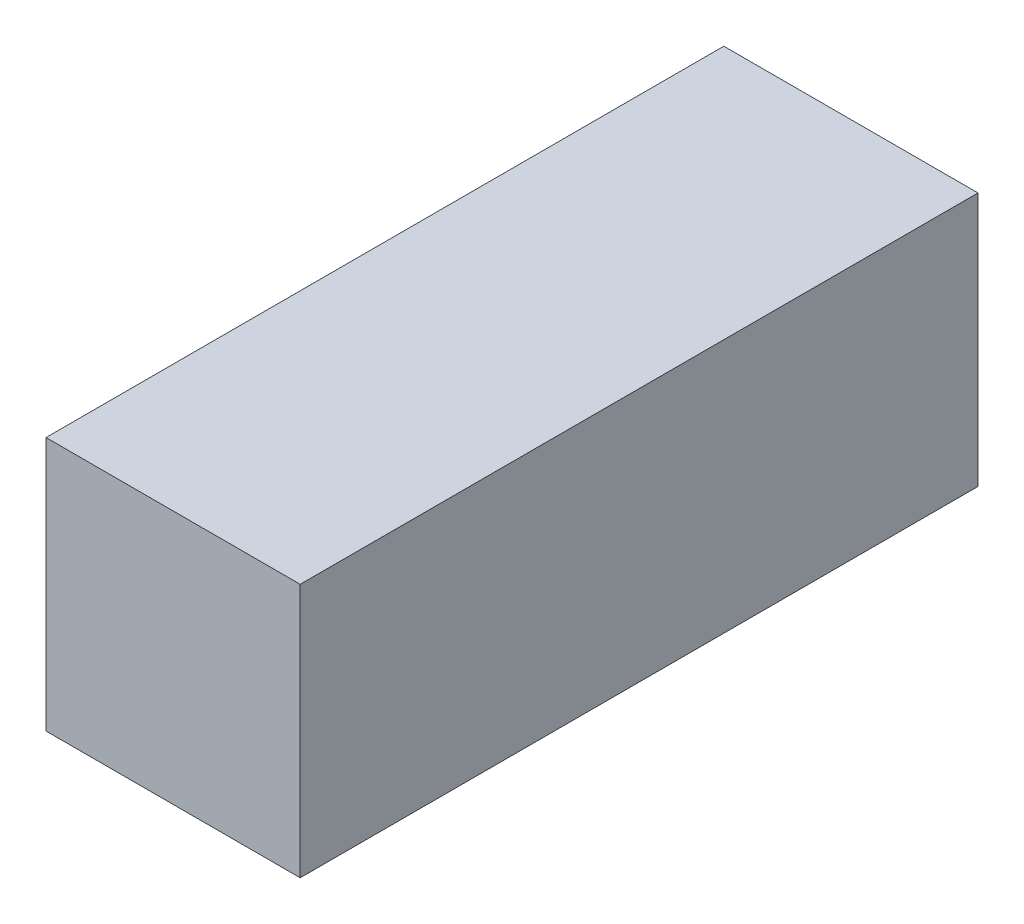
ISO-10303-21;
HEADER;
FILE_DESCRIPTION(('STEP AP214'),'2;1');
FILE_NAME('part.step','',(''),(''),'','','');
FILE_SCHEMA(('AUTOMOTIVE_DESIGN { 1 0 10303 214 1 1 1 1 }'));
ENDSEC;
DATA;
#1=APPLICATION_CONTEXT('core data for automotive mechanical design processes');
#2=APPLICATION_PROTOCOL_DEFINITION('international standard','automotive_design',2000,#1);
#3=PRODUCT_CONTEXT('',#1,'mechanical');
#4=PRODUCT('Part','Part','',(#3));
#5=PRODUCT_RELATED_PRODUCT_CATEGORY('part','',(#4));
#6=PRODUCT_DEFINITION_FORMATION('','',#4);
#7=PRODUCT_DEFINITION_CONTEXT('part definition',#1,'design');
#8=PRODUCT_DEFINITION('design','',#6,#7);
#9=PRODUCT_DEFINITION_SHAPE('','',#8);
#10=(LENGTH_UNIT() NAMED_UNIT(*) SI_UNIT(.MILLI.,.METRE.));
#11=(NAMED_UNIT(*) PLANE_ANGLE_UNIT() SI_UNIT($,.RADIAN.));
#12=(NAMED_UNIT(*) SI_UNIT($,.STERADIAN.) SOLID_ANGLE_UNIT());
#13=UNCERTAINTY_MEASURE_WITH_UNIT(LENGTH_MEASURE(1.E-05),#10,'distance_accuracy_value','');
#14=(GEOMETRIC_REPRESENTATION_CONTEXT(3) GLOBAL_UNCERTAINTY_ASSIGNED_CONTEXT((#13)) GLOBAL_UNIT_ASSIGNED_CONTEXT((#10,
#11,#12)) REPRESENTATION_CONTEXT('',''));
#15=CARTESIAN_POINT('',(0.,0.,0.));
#16=DIRECTION('',(0.,0.,1.));
#17=DIRECTION('',(1.,0.,0.));
#18=AXIS2_PLACEMENT_3D('',#15,#16,#17);
#19=CARTESIAN_POINT('',(7.5,-7.5,20.));
#20=DIRECTION('',(-1.,0.,0.));
#21=DIRECTION('',(0.,0.,1.));
#22=AXIS2_PLACEMENT_3D('',#19,#20,#21);
#23=PLANE('',#22);
#24=DIRECTION('',(0.,1.,0.));
#25=VECTOR('',#24,1.);
#26=CARTESIAN_POINT('',(7.5,-7.5,-20.));
#27=LINE('',#26,#25);
#28=CARTESIAN_POINT('',(7.5,-7.5,-20.));
#29=VERTEX_POINT('',#28);
#30=CARTESIAN_POINT('',(7.5,7.5,-20.));
#31=VERTEX_POINT('',#30);
#32=EDGE_CURVE('E108',#29,#31,#27,.T.);
#33=ORIENTED_EDGE('',*,*,#32,.T.);
#34=DIRECTION('',(0.,0.,-1.));
#35=VECTOR('',#34,1.);
#36=CARTESIAN_POINT('',(7.5,7.5,20.));
#37=LINE('',#36,#35);
#38=CARTESIAN_POINT('',(7.5,7.5,20.));
#39=VERTEX_POINT('',#38);
#40=EDGE_CURVE('E11',#39,#31,#37,.T.);
#41=ORIENTED_EDGE('',*,*,#40,.F.);
#42=DIRECTION('',(0.,1.,0.));
#43=VECTOR('',#42,1.);
#44=CARTESIAN_POINT('',(7.5,-7.5,20.));
#45=LINE('',#44,#43);
#46=CARTESIAN_POINT('',(7.5,-7.5,20.));
#47=VERTEX_POINT('',#46);
#48=EDGE_CURVE('E92',#47,#39,#45,.T.);
#49=ORIENTED_EDGE('',*,*,#48,.F.);
#50=DIRECTION('',(0.,0.,-1.));
#51=VECTOR('',#50,1.);
#52=CARTESIAN_POINT('',(7.5,-7.5,20.));
#53=LINE('',#52,#51);
#54=EDGE_CURVE('E104',#47,#29,#53,.T.);
#55=ORIENTED_EDGE('',*,*,#54,.T.);
#56=EDGE_LOOP('',(#33,#41,#49,#55));
#57=FACE_BOUND('',#56,.T.);
#58=ADVANCED_FACE('F40',(#57),#23,.F.);
#59=CARTESIAN_POINT('',(-7.5,7.5,20.));
#60=DIRECTION('',(0.,-1.,0.));
#61=DIRECTION('',(0.,0.,-1.));
#62=AXIS2_PLACEMENT_3D('',#59,#60,#61);
#63=PLANE('',#62);
#64=DIRECTION('',(-1.,0.,0.));
#65=VECTOR('',#64,1.);
#66=CARTESIAN_POINT('',(-7.5,7.5,-20.));
#67=LINE('',#66,#65);
#68=CARTESIAN_POINT('',(-7.5,7.5,-20.));
#69=VERTEX_POINT('',#68);
#70=EDGE_CURVE('E97',#31,#69,#67,.T.);
#71=ORIENTED_EDGE('',*,*,#70,.T.);
#72=DIRECTION('',(0.,0.,-1.));
#73=VECTOR('',#72,1.);
#74=CARTESIAN_POINT('',(-7.5,7.5,20.));
#75=LINE('',#74,#73);
#76=CARTESIAN_POINT('',(-7.5,7.5,20.));
#77=VERTEX_POINT('',#76);
#78=EDGE_CURVE('E49',#77,#69,#75,.T.);
#79=ORIENTED_EDGE('',*,*,#78,.F.);
#80=DIRECTION('',(-1.,0.,0.));
#81=VECTOR('',#80,1.);
#82=CARTESIAN_POINT('',(-7.5,7.5,20.));
#83=LINE('',#82,#81);
#84=EDGE_CURVE('E87',#39,#77,#83,.T.);
#85=ORIENTED_EDGE('',*,*,#84,.F.);
#86=ORIENTED_EDGE('',*,*,#40,.T.);
#87=EDGE_LOOP('',(#71,#79,#85,#86));
#88=FACE_BOUND('',#87,.T.);
#89=ADVANCED_FACE('F96',(#88),#63,.F.);
#90=CARTESIAN_POINT('',(-7.5,-7.5,20.));
#91=DIRECTION('',(1.,0.,0.));
#92=DIRECTION('',(0.,0.,-1.));
#93=AXIS2_PLACEMENT_3D('',#90,#91,#92);
#94=PLANE('',#93);
#95=DIRECTION('',(0.,-1.,0.));
#96=VECTOR('',#95,1.);
#97=CARTESIAN_POINT('',(-7.5,-7.5,-20.));
#98=LINE('',#97,#96);
#99=CARTESIAN_POINT('',(-7.5,-7.5,-20.));
#100=VERTEX_POINT('',#99);
#101=EDGE_CURVE('E74',#69,#100,#98,.T.);
#102=ORIENTED_EDGE('',*,*,#101,.T.);
#103=DIRECTION('',(0.,0.,-1.));
#104=VECTOR('',#103,1.);
#105=CARTESIAN_POINT('',(-7.5,-7.5,20.));
#106=LINE('',#105,#104);
#107=CARTESIAN_POINT('',(-7.5,-7.5,20.));
#108=VERTEX_POINT('',#107);
#109=EDGE_CURVE('E99',#108,#100,#106,.T.);
#110=ORIENTED_EDGE('',*,*,#109,.F.);
#111=DIRECTION('',(0.,-1.,0.));
#112=VECTOR('',#111,1.);
#113=CARTESIAN_POINT('',(-7.5,-7.5,20.));
#114=LINE('',#113,#112);
#115=EDGE_CURVE('E90',#77,#108,#114,.T.);
#116=ORIENTED_EDGE('',*,*,#115,.F.);
#117=ORIENTED_EDGE('',*,*,#78,.T.);
#118=EDGE_LOOP('',(#102,#110,#116,#117));
#119=FACE_BOUND('',#118,.T.);
#120=ADVANCED_FACE('F100',(#119),#94,.F.);
#121=CARTESIAN_POINT('',(-7.5,-7.5,20.));
#122=DIRECTION('',(0.,1.,0.));
#123=DIRECTION('',(0.,0.,1.));
#124=AXIS2_PLACEMENT_3D('',#121,#122,#123);
#125=PLANE('',#124);
#126=DIRECTION('',(1.,0.,0.));
#127=VECTOR('',#126,1.);
#128=CARTESIAN_POINT('',(-7.5,-7.5,-20.));
#129=LINE('',#128,#127);
#130=EDGE_CURVE('E80',#100,#29,#129,.T.);
#131=ORIENTED_EDGE('',*,*,#130,.T.);
#132=ORIENTED_EDGE('',*,*,#54,.F.);
#133=DIRECTION('',(1.,0.,0.));
#134=VECTOR('',#133,1.);
#135=CARTESIAN_POINT('',(-7.5,-7.5,20.));
#136=LINE('',#135,#134);
#137=EDGE_CURVE('E57',#108,#47,#136,.T.);
#138=ORIENTED_EDGE('',*,*,#137,.F.);
#139=ORIENTED_EDGE('',*,*,#109,.T.);
#140=EDGE_LOOP('',(#131,#132,#138,#139));
#141=FACE_BOUND('',#140,.T.);
#142=ADVANCED_FACE('F122',(#141),#125,.F.);
#143=CARTESIAN_POINT('',(0.,0.,20.));
#144=DIRECTION('',(0.,0.,-1.));
#145=DIRECTION('',(-1.,0.,0.));
#146=AXIS2_PLACEMENT_3D('',#143,#144,#145);
#147=PLANE('',#146);
#148=ORIENTED_EDGE('',*,*,#48,.T.);
#149=ORIENTED_EDGE('',*,*,#84,.T.);
#150=ORIENTED_EDGE('',*,*,#115,.T.);
#151=ORIENTED_EDGE('',*,*,#137,.T.);
#152=EDGE_LOOP('',(#148,#149,#150,#151));
#153=FACE_BOUND('',#152,.T.);
#154=ADVANCED_FACE('F88',(#153),#147,.F.);
#155=CARTESIAN_POINT('',(0.,0.,-20.));
#156=DIRECTION('',(0.,0.,-1.));
#157=DIRECTION('',(-1.,0.,0.));
#158=AXIS2_PLACEMENT_3D('',#155,#156,#157);
#159=PLANE('',#158);
#160=ORIENTED_EDGE('',*,*,#32,.F.);
#161=ORIENTED_EDGE('',*,*,#130,.F.);
#162=ORIENTED_EDGE('',*,*,#101,.F.);
#163=ORIENTED_EDGE('',*,*,#70,.F.);
#164=EDGE_LOOP('',(#160,#161,#162,#163));
#165=FACE_BOUND('',#164,.T.);
#166=ADVANCED_FACE('F125',(#165),#159,.T.);
#167=CLOSED_SHELL('',(#58,#89,#120,#142,#154,#166));
#168=CARTESIAN_POINT('',(0.,0.,-17.5));
#169=DIRECTION('',(0.,0.,1.));
#170=DIRECTION('',(1.,0.,0.));
#171=AXIS2_PLACEMENT_3D('',#168,#169,#170);
#172=CYLINDRICAL_SURFACE('',#171,5.);
#173=CARTESIAN_POINT('',(0.,0.,-17.5));
#174=DIRECTION('',(0.,0.,1.));
#175=DIRECTION('',(1.,0.,0.));
#176=AXIS2_PLACEMENT_3D('',#173,#174,#175);
#177=CIRCLE('',#176,5.);
#178=CARTESIAN_POINT('',(5.,0.,-17.5));
#179=VERTEX_POINT('',#178);
#180=EDGE_CURVE('E112',#179,#179,#177,.T.);
#181=ORIENTED_EDGE('',*,*,#180,.F.);
#182=EDGE_LOOP('',(#181));
#183=FACE_BOUND('',#182,.T.);
#184=CARTESIAN_POINT('',(0.,0.,17.5));
#185=DIRECTION('',(0.,0.,1.));
#186=DIRECTION('',(1.,0.,0.));
#187=AXIS2_PLACEMENT_3D('',#184,#185,#186);
#188=CIRCLE('',#187,5.);
#189=CARTESIAN_POINT('',(5.,0.,17.5));
#190=VERTEX_POINT('',#189);
#191=EDGE_CURVE('E129',#190,#190,#188,.T.);
#192=ORIENTED_EDGE('',*,*,#191,.T.);
#193=EDGE_LOOP('',(#192));
#194=FACE_BOUND('',#193,.T.);
#195=ADVANCED_FACE('F139',(#183,#194),#172,.F.);
#196=CARTESIAN_POINT('',(0.,0.,-17.5));
#197=DIRECTION('',(0.,0.,1.));
#198=DIRECTION('',(1.,0.,0.));
#199=AXIS2_PLACEMENT_3D('',#196,#197,#198);
#200=PLANE('',#199);
#201=ORIENTED_EDGE('',*,*,#180,.T.);
#202=EDGE_LOOP('',(#201));
#203=FACE_BOUND('',#202,.T.);
#204=ADVANCED_FACE('F137',(#203),#200,.T.);
#205=CARTESIAN_POINT('',(0.,0.,17.5));
#206=DIRECTION('',(0.,0.,1.));
#207=DIRECTION('',(1.,0.,0.));
#208=AXIS2_PLACEMENT_3D('',#205,#206,#207);
#209=PLANE('',#208);
#210=ORIENTED_EDGE('',*,*,#191,.F.);
#211=EDGE_LOOP('',(#210));
#212=FACE_BOUND('',#211,.T.);
#213=ADVANCED_FACE('F146',(#212),#209,.F.);
#214=CLOSED_SHELL('',(#195,#204,#213));
#215=ORIENTED_CLOSED_SHELL('',*,#214,.T.);
#216=BREP_WITH_VOIDS('B2',#167,(#215));
#217=ADVANCED_BREP_SHAPE_REPRESENTATION('',(#18,#216),#14);
#218=SHAPE_DEFINITION_REPRESENTATION(#9,#217);
ENDSEC;
END-ISO-10303-21;
